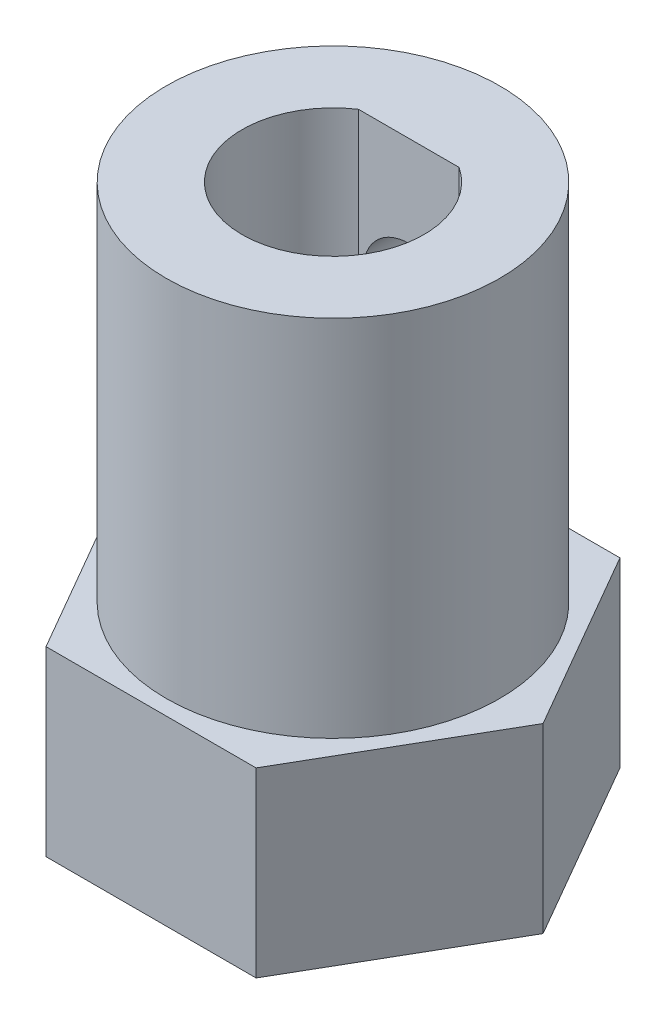
ISO-10303-21;
HEADER;
FILE_DESCRIPTION(('STEP AP214'),'2;1');
FILE_NAME('part.step','',(''),(''),'','','');
FILE_SCHEMA(('AUTOMOTIVE_DESIGN { 1 0 10303 214 1 1 1 1 }'));
ENDSEC;
DATA;
#1=APPLICATION_CONTEXT('core data for automotive mechanical design processes');
#2=APPLICATION_PROTOCOL_DEFINITION('international standard','automotive_design',2000,#1);
#3=PRODUCT_CONTEXT('',#1,'mechanical');
#4=PRODUCT('Part','Part','',(#3));
#5=PRODUCT_RELATED_PRODUCT_CATEGORY('part','',(#4));
#6=PRODUCT_DEFINITION_FORMATION('','',#4);
#7=PRODUCT_DEFINITION_CONTEXT('part definition',#1,'design');
#8=PRODUCT_DEFINITION('design','',#6,#7);
#9=PRODUCT_DEFINITION_SHAPE('','',#8);
#10=(LENGTH_UNIT() NAMED_UNIT(*) SI_UNIT(.MILLI.,.METRE.));
#11=(NAMED_UNIT(*) PLANE_ANGLE_UNIT() SI_UNIT($,.RADIAN.));
#12=(NAMED_UNIT(*) SI_UNIT($,.STERADIAN.) SOLID_ANGLE_UNIT());
#13=UNCERTAINTY_MEASURE_WITH_UNIT(LENGTH_MEASURE(1.E-05),#10,'distance_accuracy_value','');
#14=(GEOMETRIC_REPRESENTATION_CONTEXT(3) GLOBAL_UNCERTAINTY_ASSIGNED_CONTEXT((#13)) GLOBAL_UNIT_ASSIGNED_CONTEXT((#10,
#11,#12)) REPRESENTATION_CONTEXT('',''));
#15=CARTESIAN_POINT('',(0.,0.,0.));
#16=DIRECTION('',(0.,0.,1.));
#17=DIRECTION('',(1.,0.,0.));
#18=AXIS2_PLACEMENT_3D('',#15,#16,#17);
#19=CARTESIAN_POINT('',(3.46410161513776,6.,6.00000000000001));
#20=DIRECTION('',(-0.866025403784439,0.,-0.5));
#21=DIRECTION('',(-0.5,0.,0.866025403784439));
#22=AXIS2_PLACEMENT_3D('',#19,#20,#21);
#23=PLANE('',#22);
#24=DIRECTION('',(0.5,0.,-0.866025403784439));
#25=VECTOR('',#24,1.);
#26=CARTESIAN_POINT('',(3.46410161513776,0.,6.00000000000001));
#27=LINE('',#26,#25);
#28=CARTESIAN_POINT('',(3.46410161513776,0.,6.00000000000001));
#29=VERTEX_POINT('',#28);
#30=CARTESIAN_POINT('',(6.92820323027551,0.,0.));
#31=VERTEX_POINT('',#30);
#32=EDGE_CURVE('E130',#29,#31,#27,.T.);
#33=ORIENTED_EDGE('',*,*,#32,.T.);
#34=DIRECTION('',(0.,-1.,0.));
#35=VECTOR('',#34,1.);
#36=CARTESIAN_POINT('',(6.92820323027551,6.,0.));
#37=LINE('',#36,#35);
#38=CARTESIAN_POINT('',(6.92820323027551,6.,0.));
#39=VERTEX_POINT('',#38);
#40=EDGE_CURVE('E35',#39,#31,#37,.T.);
#41=ORIENTED_EDGE('',*,*,#40,.F.);
#42=DIRECTION('',(0.5,0.,-0.866025403784439));
#43=VECTOR('',#42,1.);
#44=CARTESIAN_POINT('',(3.46410161513776,6.,6.00000000000001));
#45=LINE('',#44,#43);
#46=CARTESIAN_POINT('',(3.46410161513776,6.,6.00000000000001));
#47=VERTEX_POINT('',#46);
#48=EDGE_CURVE('E142',#47,#39,#45,.T.);
#49=ORIENTED_EDGE('',*,*,#48,.F.);
#50=DIRECTION('',(0.,-1.,0.));
#51=VECTOR('',#50,1.);
#52=CARTESIAN_POINT('',(3.46410161513776,6.,6.00000000000001));
#53=LINE('',#52,#51);
#54=EDGE_CURVE('E126',#47,#29,#53,.T.);
#55=ORIENTED_EDGE('',*,*,#54,.T.);
#56=EDGE_LOOP('',(#33,#41,#49,#55));
#57=FACE_BOUND('',#56,.T.);
#58=ADVANCED_FACE('F32',(#57),#23,.F.);
#59=CARTESIAN_POINT('',(6.92820323027551,6.,0.));
#60=DIRECTION('',(-0.866025403784439,0.,0.5));
#61=DIRECTION('',(0.5,0.,0.866025403784439));
#62=AXIS2_PLACEMENT_3D('',#59,#60,#61);
#63=PLANE('',#62);
#64=DIRECTION('',(-0.5,0.,-0.866025403784439));
#65=VECTOR('',#64,1.);
#66=CARTESIAN_POINT('',(6.92820323027551,0.,0.));
#67=LINE('',#66,#65);
#68=CARTESIAN_POINT('',(3.46410161513776,0.,-6.00000000000001));
#69=VERTEX_POINT('',#68);
#70=EDGE_CURVE('E133',#31,#69,#67,.T.);
#71=ORIENTED_EDGE('',*,*,#70,.T.);
#72=DIRECTION('',(0.,-1.,0.));
#73=VECTOR('',#72,1.);
#74=CARTESIAN_POINT('',(3.46410161513776,6.,-6.00000000000001));
#75=LINE('',#74,#73);
#76=CARTESIAN_POINT('',(3.46410161513776,6.,-6.00000000000001));
#77=VERTEX_POINT('',#76);
#78=EDGE_CURVE('E145',#77,#69,#75,.T.);
#79=ORIENTED_EDGE('',*,*,#78,.F.);
#80=DIRECTION('',(-0.5,0.,-0.866025403784439));
#81=VECTOR('',#80,1.);
#82=CARTESIAN_POINT('',(6.92820323027551,6.,0.));
#83=LINE('',#82,#81);
#84=EDGE_CURVE('E92',#39,#77,#83,.T.);
#85=ORIENTED_EDGE('',*,*,#84,.F.);
#86=ORIENTED_EDGE('',*,*,#40,.T.);
#87=EDGE_LOOP('',(#71,#79,#85,#86));
#88=FACE_BOUND('',#87,.T.);
#89=ADVANCED_FACE('F150',(#88),#63,.F.);
#90=CARTESIAN_POINT('',(3.46410161513776,6.,-6.00000000000001));
#91=DIRECTION('',(0.,0.,1.));
#92=DIRECTION('',(1.,0.,0.));
#93=AXIS2_PLACEMENT_3D('',#90,#91,#92);
#94=PLANE('',#93);
#95=DIRECTION('',(-1.,0.,0.));
#96=VECTOR('',#95,1.);
#97=CARTESIAN_POINT('',(3.46410161513776,0.,-6.00000000000001));
#98=LINE('',#97,#96);
#99=CARTESIAN_POINT('',(-3.46410161513776,0.,-6.));
#100=VERTEX_POINT('',#99);
#101=EDGE_CURVE('E136',#69,#100,#98,.T.);
#102=ORIENTED_EDGE('',*,*,#101,.T.);
#103=DIRECTION('',(0.,-1.,0.));
#104=VECTOR('',#103,1.);
#105=CARTESIAN_POINT('',(-3.46410161513776,6.,-6.));
#106=LINE('',#105,#104);
#107=CARTESIAN_POINT('',(-3.46410161513776,6.,-6.));
#108=VERTEX_POINT('',#107);
#109=EDGE_CURVE('E121',#108,#100,#106,.T.);
#110=ORIENTED_EDGE('',*,*,#109,.F.);
#111=DIRECTION('',(-1.,0.,0.));
#112=VECTOR('',#111,1.);
#113=CARTESIAN_POINT('',(3.46410161513776,6.,-6.00000000000001));
#114=LINE('',#113,#112);
#115=EDGE_CURVE('E109',#77,#108,#114,.T.);
#116=ORIENTED_EDGE('',*,*,#115,.F.);
#117=ORIENTED_EDGE('',*,*,#78,.T.);
#118=EDGE_LOOP('',(#102,#110,#116,#117));
#119=FACE_BOUND('',#118,.T.);
#120=ADVANCED_FACE('F156',(#119),#94,.F.);
#121=CARTESIAN_POINT('',(-3.46410161513776,6.,-6.));
#122=DIRECTION('',(0.866025403784439,0.,0.5));
#123=DIRECTION('',(0.5,0.,-0.866025403784439));
#124=AXIS2_PLACEMENT_3D('',#121,#122,#123);
#125=PLANE('',#124);
#126=DIRECTION('',(-0.5,0.,0.866025403784439));
#127=VECTOR('',#126,1.);
#128=CARTESIAN_POINT('',(-3.46410161513776,0.,-6.));
#129=LINE('',#128,#127);
#130=CARTESIAN_POINT('',(-6.92820323027551,0.,0.));
#131=VERTEX_POINT('',#130);
#132=EDGE_CURVE('E118',#100,#131,#129,.T.);
#133=ORIENTED_EDGE('',*,*,#132,.T.);
#134=DIRECTION('',(0.,-1.,0.));
#135=VECTOR('',#134,1.);
#136=CARTESIAN_POINT('',(-6.92820323027551,6.,0.));
#137=LINE('',#136,#135);
#138=CARTESIAN_POINT('',(-6.92820323027551,6.,0.));
#139=VERTEX_POINT('',#138);
#140=EDGE_CURVE('E115',#139,#131,#137,.T.);
#141=ORIENTED_EDGE('',*,*,#140,.F.);
#142=DIRECTION('',(-0.5,0.,0.866025403784439));
#143=VECTOR('',#142,1.);
#144=CARTESIAN_POINT('',(-3.46410161513776,6.,-6.));
#145=LINE('',#144,#143);
#146=EDGE_CURVE('E102',#108,#139,#145,.T.);
#147=ORIENTED_EDGE('',*,*,#146,.F.);
#148=ORIENTED_EDGE('',*,*,#109,.T.);
#149=EDGE_LOOP('',(#133,#141,#147,#148));
#150=FACE_BOUND('',#149,.T.);
#151=ADVANCED_FACE('F116',(#150),#125,.F.);
#152=CARTESIAN_POINT('',(-6.92820323027551,6.,0.));
#153=DIRECTION('',(0.866025403784438,0.,-0.5));
#154=DIRECTION('',(-0.5,0.,-0.866025403784439));
#155=AXIS2_PLACEMENT_3D('',#152,#153,#154);
#156=PLANE('',#155);
#157=DIRECTION('',(0.5,0.,0.866025403784439));
#158=VECTOR('',#157,1.);
#159=CARTESIAN_POINT('',(-6.92820323027551,0.,0.));
#160=LINE('',#159,#158);
#161=CARTESIAN_POINT('',(-3.46410161513776,0.,6.00000000000001));
#162=VERTEX_POINT('',#161);
#163=EDGE_CURVE('E139',#131,#162,#160,.T.);
#164=ORIENTED_EDGE('',*,*,#163,.T.);
#165=DIRECTION('',(0.,-1.,0.));
#166=VECTOR('',#165,1.);
#167=CARTESIAN_POINT('',(-3.46410161513776,6.,6.00000000000001));
#168=LINE('',#167,#166);
#169=CARTESIAN_POINT('',(-3.46410161513776,6.,6.00000000000001));
#170=VERTEX_POINT('',#169);
#171=EDGE_CURVE('E122',#170,#162,#168,.T.);
#172=ORIENTED_EDGE('',*,*,#171,.F.);
#173=DIRECTION('',(0.5,0.,0.866025403784439));
#174=VECTOR('',#173,1.);
#175=CARTESIAN_POINT('',(-6.92820323027551,6.,0.));
#176=LINE('',#175,#174);
#177=EDGE_CURVE('E106',#139,#170,#176,.T.);
#178=ORIENTED_EDGE('',*,*,#177,.F.);
#179=ORIENTED_EDGE('',*,*,#140,.T.);
#180=EDGE_LOOP('',(#164,#172,#178,#179));
#181=FACE_BOUND('',#180,.T.);
#182=ADVANCED_FACE('F124',(#181),#156,.F.);
#183=CARTESIAN_POINT('',(-3.46410161513776,6.,6.00000000000001));
#184=DIRECTION('',(0.,0.,-1.));
#185=DIRECTION('',(-1.,0.,0.));
#186=AXIS2_PLACEMENT_3D('',#183,#184,#185);
#187=PLANE('',#186);
#188=DIRECTION('',(1.,0.,0.));
#189=VECTOR('',#188,1.);
#190=CARTESIAN_POINT('',(-3.46410161513776,0.,6.00000000000001));
#191=LINE('',#190,#189);
#192=EDGE_CURVE('E83',#162,#29,#191,.T.);
#193=ORIENTED_EDGE('',*,*,#192,.T.);
#194=ORIENTED_EDGE('',*,*,#54,.F.);
#195=DIRECTION('',(1.,0.,0.));
#196=VECTOR('',#195,1.);
#197=CARTESIAN_POINT('',(-3.46410161513776,6.,6.00000000000001));
#198=LINE('',#197,#196);
#199=EDGE_CURVE('E56',#170,#47,#198,.T.);
#200=ORIENTED_EDGE('',*,*,#199,.F.);
#201=ORIENTED_EDGE('',*,*,#171,.T.);
#202=EDGE_LOOP('',(#193,#194,#200,#201));
#203=FACE_BOUND('',#202,.T.);
#204=ADVANCED_FACE('F228',(#203),#187,.F.);
#205=CARTESIAN_POINT('',(0.,6.,0.));
#206=DIRECTION('',(0.,1.,0.));
#207=DIRECTION('',(0.,0.,1.));
#208=AXIS2_PLACEMENT_3D('',#205,#206,#207);
#209=PLANE('',#208);
#210=CARTESIAN_POINT('',(0.,6.,0.));
#211=DIRECTION('',(0.,1.,0.));
#212=DIRECTION('',(0.,0.,1.));
#213=AXIS2_PLACEMENT_3D('',#210,#211,#212);
#214=CIRCLE('',#213,5.5);
#215=CARTESIAN_POINT('',(0.,6.,5.5));
#216=VERTEX_POINT('',#215);
#217=EDGE_CURVE('E11',#216,#216,#214,.T.);
#218=ORIENTED_EDGE('',*,*,#217,.F.);
#219=EDGE_LOOP('',(#218));
#220=FACE_BOUND('',#219,.T.);
#221=ORIENTED_EDGE('',*,*,#48,.T.);
#222=ORIENTED_EDGE('',*,*,#84,.T.);
#223=ORIENTED_EDGE('',*,*,#115,.T.);
#224=ORIENTED_EDGE('',*,*,#146,.T.);
#225=ORIENTED_EDGE('',*,*,#177,.T.);
#226=ORIENTED_EDGE('',*,*,#199,.T.);
#227=EDGE_LOOP('',(#221,#222,#223,#224,#225,#226));
#228=FACE_BOUND('',#227,.T.);
#229=ADVANCED_FACE('F104',(#220,#228),#209,.T.);
#230=CARTESIAN_POINT('',(0.,0.,0.));
#231=DIRECTION('',(0.,1.,0.));
#232=DIRECTION('',(0.,0.,1.));
#233=AXIS2_PLACEMENT_3D('',#230,#231,#232);
#234=PLANE('',#233);
#235=CARTESIAN_POINT('',(0.,0.,0.));
#236=DIRECTION('',(0.,-1.,0.));
#237=DIRECTION('',(0.,0.,-1.));
#238=AXIS2_PLACEMENT_3D('',#235,#236,#237);
#239=CIRCLE('',#238,2.);
#240=CARTESIAN_POINT('',(0.,0.,-2.));
#241=VERTEX_POINT('',#240);
#242=EDGE_CURVE('E286',#241,#241,#239,.T.);
#243=ORIENTED_EDGE('',*,*,#242,.F.);
#244=EDGE_LOOP('',(#243));
#245=FACE_BOUND('',#244,.T.);
#246=ORIENTED_EDGE('',*,*,#32,.F.);
#247=ORIENTED_EDGE('',*,*,#192,.F.);
#248=ORIENTED_EDGE('',*,*,#163,.F.);
#249=ORIENTED_EDGE('',*,*,#132,.F.);
#250=ORIENTED_EDGE('',*,*,#101,.F.);
#251=ORIENTED_EDGE('',*,*,#70,.F.);
#252=EDGE_LOOP('',(#246,#247,#248,#249,#250,#251));
#253=FACE_BOUND('',#252,.T.);
#254=ADVANCED_FACE('F155',(#245,#253),#234,.F.);
#255=CARTESIAN_POINT('',(0.,18.,0.));
#256=DIRECTION('',(0.,-1.,0.));
#257=DIRECTION('',(0.,0.,-1.));
#258=AXIS2_PLACEMENT_3D('',#255,#256,#257);
#259=CYLINDRICAL_SURFACE('',#258,5.5);
#260=CARTESIAN_POINT('',(0.,15.,-5.5));
#261=CARTESIAN_POINT('',(-0.0826209133321935,14.999998187389,-5.49999882717412));
#262=CARTESIAN_POINT('',(-0.165260978812708,14.9931509364166,-5.49812007260761));
#263=CARTESIAN_POINT('',(-0.328155930157697,14.9659941696968,-5.49080798085451));
#264=CARTESIAN_POINT('',(-0.408409727977265,14.9456786083714,-5.48537304740499));
#265=CARTESIAN_POINT('',(-0.564157626055395,14.8922982682616,-5.47154772174135));
#266=CARTESIAN_POINT('',(-0.639657866970163,14.8592503473381,-5.46316123869395));
#267=CARTESIAN_POINT('',(-0.78404449615972,14.7814070673376,-5.44431654412848));
#268=CARTESIAN_POINT('',(-0.852930363289777,14.7366107836461,-5.43385816956517));
#269=CARTESIAN_POINT('',(-0.983796947573261,14.6354001635327,-5.41171397042059));
#270=CARTESIAN_POINT('',(-1.04559512916994,14.5787545591458,-5.40000641490429));
#271=CARTESIAN_POINT('',(-1.15894293682478,14.4559473639701,-5.37682112935063));
#272=CARTESIAN_POINT('',(-1.21049117824722,14.3897844895977,-5.36534343055203));
#273=CARTESIAN_POINT('',(-1.30277794539497,14.2483487524205,-5.34369384163659));
#274=CARTESIAN_POINT('',(-1.34330426837586,14.1729328550637,-5.33354930058623));
#275=CARTESIAN_POINT('',(-1.41102916361228,14.0160361718006,-5.31603507411917));
#276=CARTESIAN_POINT('',(-1.43823031946844,13.9345565651115,-5.30866485085754));
#277=CARTESIAN_POINT('',(-1.47789456441268,13.7698721049875,-5.2977584719274));
#278=CARTESIAN_POINT('',(-1.49068960543229,13.6867530518381,-5.29413612283787));
#279=CARTESIAN_POINT('',(-1.50221364409134,13.5194753169912,-5.29087829084083));
#280=CARTESIAN_POINT('',(-1.50094540140882,13.4353168425,-5.2912420257326));
#281=CARTESIAN_POINT('',(-1.48464191780301,13.2709584490337,-5.29583824875456));
#282=CARTESIAN_POINT('',(-1.47001073668932,13.1907147653978,-5.29995718313671));
#283=CARTESIAN_POINT('',(-1.42804483871807,13.0338667139772,-5.31141755794059));
#284=CARTESIAN_POINT('',(-1.40070906504647,12.9572626495337,-5.31875926644153));
#285=CARTESIAN_POINT('',(-1.3337862982647,12.8088264794526,-5.33593618292326));
#286=CARTESIAN_POINT('',(-1.29405951882948,12.7370607989664,-5.34579959764141));
#287=CARTESIAN_POINT('',(-1.20357988022174,12.6010735525903,-5.36689368797792));
#288=CARTESIAN_POINT('',(-1.15282476106209,12.5368535371613,-5.37812464363249));
#289=CARTESIAN_POINT('',(-1.03967346682896,12.4154748101936,-5.40115894990605));
#290=CARTESIAN_POINT('',(-0.976938646167253,12.3586325507111,-5.41296874297114));
#291=CARTESIAN_POINT('',(-0.842682011788638,12.2562090350222,-5.43548647707978));
#292=CARTESIAN_POINT('',(-0.771159819718556,12.2106282639504,-5.44619437064292));
#293=CARTESIAN_POINT('',(-0.620853953739625,12.1318733272251,-5.46537278121261));
#294=CARTESIAN_POINT('',(-0.542037637417775,12.0987586614161,-5.47383251287305));
#295=CARTESIAN_POINT('',(-0.379672688714392,12.0463420274859,-5.48748356142612));
#296=CARTESIAN_POINT('',(-0.296125144317683,12.0270368975559,-5.49267562644564));
#297=CARTESIAN_POINT('',(-0.129368170483252,12.003289382203,-5.49909228776313));
#298=CARTESIAN_POINT('',(-0.0462242977839815,11.9984170046796,-5.50043163125371));
#299=CARTESIAN_POINT('',(0.119693365637971,12.0024827475134,-5.49932301585136));
#300=CARTESIAN_POINT('',(0.202467195532506,12.0114193696165,-5.49687546782998));
#301=CARTESIAN_POINT('',(0.363745097739556,12.0424975027031,-5.48854239265957));
#302=CARTESIAN_POINT('',(0.442299324272676,12.064397192757,-5.48271986472129));
#303=CARTESIAN_POINT('',(0.594609867448631,12.1204972446405,-5.46829923535645));
#304=CARTESIAN_POINT('',(0.668365651304995,12.1546989696613,-5.45970082634473));
#305=CARTESIAN_POINT('',(0.810641161194589,12.2352164422857,-5.44041573828275));
#306=CARTESIAN_POINT('',(0.879024602412581,12.2817634872616,-5.4296902954988));
#307=CARTESIAN_POINT('',(1.00716022013082,12.3853612875452,-5.40738988410035));
#308=CARTESIAN_POINT('',(1.06691060617763,12.4424142161575,-5.39581474001048));
#309=CARTESIAN_POINT('',(1.17791060344312,12.5674140380349,-5.37269401558495));
#310=CARTESIAN_POINT('',(1.22885627747222,12.635633382279,-5.36115944983886));
#311=CARTESIAN_POINT('',(1.3185858220796,12.7798986472193,-5.33980026187814));
#312=CARTESIAN_POINT('',(1.35737017925923,12.8559442546075,-5.32997557125461));
#313=CARTESIAN_POINT('',(1.42138558317209,13.013340628242,-5.31326248703816));
#314=CARTESIAN_POINT('',(1.44669352306985,13.0946582605252,-5.30635748202252));
#315=CARTESIAN_POINT('',(1.48320917220691,13.2606168380276,-5.29626814696188));
#316=CARTESIAN_POINT('',(1.49442068863148,13.3452568795537,-5.29308281231876));
#317=CARTESIAN_POINT('',(1.50219895576908,13.5123384038175,-5.29088009671763));
#318=CARTESIAN_POINT('',(1.49925533217026,13.5947555887225,-5.29172336001588));
#319=CARTESIAN_POINT('',(1.47994837643976,13.757870647735,-5.29715501736986));
#320=CARTESIAN_POINT('',(1.46358542028567,13.838568569947,-5.30174330649891));
#321=CARTESIAN_POINT('',(1.41819408435119,13.9953063157761,-5.31406316491799));
#322=CARTESIAN_POINT('',(1.38927395449127,14.0713797532418,-5.32176783125817));
#323=CARTESIAN_POINT('',(1.31967304541385,14.2176532768133,-5.33945189987964));
#324=CARTESIAN_POINT('',(1.27899034504456,14.2878524010652,-5.34943167369227));
#325=CARTESIAN_POINT('',(1.18555430984851,14.4227105976927,-5.37092379381814));
#326=CARTESIAN_POINT('',(1.13246901822125,14.4871337048431,-5.38247375845259));
#327=CARTESIAN_POINT('',(1.01636011199274,14.6063164067946,-5.40559990490855));
#328=CARTESIAN_POINT('',(0.953334059387993,14.6610736240053,-5.41717609247304));
#329=CARTESIAN_POINT('',(0.817407725686078,14.7605946145194,-5.43936459177359));
#330=CARTESIAN_POINT('',(0.74431586626252,14.805103480867,-5.44994907753807));
#331=CARTESIAN_POINT('',(0.59139989983928,14.8811324362115,-5.46865263780403));
#332=CARTESIAN_POINT('',(0.511579952421221,14.9126604805543,-5.47677322151197));
#333=CARTESIAN_POINT('',(0.360100101218211,14.957939509979,-5.48864193995757));
#334=CARTESIAN_POINT('',(0.289064640262469,14.9736745512417,-5.49286947681091));
#335=CARTESIAN_POINT('',(0.145357607941485,14.9947050253188,-5.49854887164354));
#336=CARTESIAN_POINT('',(0.0726862155649473,15.0000015946548,-5.5000010318002));
#337=CARTESIAN_POINT('',(0.,15.,-5.5));
#338=B_SPLINE_CURVE_WITH_KNOTS('',3,(#260,#261,#262,#263,#264,#265,#266,#267,#268,#269,#270,
#271,#272,#273,#274,#275,#276,#277,#278,#279,#280,#281,#282,#283,#284,#285,#286,#287,#288,#289,
#290,#291,#292,#293,#294,#295,#296,#297,#298,#299,#300,#301,#302,#303,#304,#305,#306,#307,#308,
#309,#310,#311,#312,#313,#314,#315,#316,#317,#318,#319,#320,#321,#322,#323,#324,#325,#326,#327,
#328,#329,#330,#331,#332,#333,#334,#335,#336,#337),.UNSPECIFIED.,.T.,.F.,(4,2,2,2,2,2,2,2,2,2,2,
2,2,2,2,2,2,2,2,2,2,2,2,2,2,2,2,2,2,2,2,2,2,2,2,2,2,2,4),(0.,0.247596106854897,0.4953034285513,
0.742683902420579,0.990083851364706,1.24285878223179,1.49566783659324,1.75304593650219,
2.01037411390996,2.26164304860926,2.51286267696538,2.75672886674887,3.00061534583717,
3.24735926767928,3.49415380139121,3.74938528550775,4.00462776284424,4.26107349736028,
4.51746049766944,4.76612811343083,5.01476875105251,5.25891111200195,5.50308053475836,
5.75219469009681,6.00136043656003,6.2579007306487,6.51443075867912,6.76948096455404,
7.02446227124211,7.27068852228629,7.51690787489588,7.76104555655817,8.00522313517586,
8.25689011392092,8.50861891104974,8.76605872289058,9.02334052607436,9.2411883209319,
9.45901239561305),.UNSPECIFIED.);
#339=CARTESIAN_POINT('',(0.,15.,-5.5));
#340=VERTEX_POINT('',#339);
#341=EDGE_CURVE('E172',#340,#340,#338,.T.);
#342=ORIENTED_EDGE('',*,*,#341,.T.);
#343=EDGE_LOOP('',(#342));
#344=FACE_BOUND('',#343,.T.);
#345=CARTESIAN_POINT('',(0.,18.,0.));
#346=DIRECTION('',(0.,1.,0.));
#347=DIRECTION('',(0.,0.,1.));
#348=AXIS2_PLACEMENT_3D('',#345,#346,#347);
#349=CIRCLE('',#348,5.5);
#350=CARTESIAN_POINT('',(0.,18.,5.5));
#351=VERTEX_POINT('',#350);
#352=EDGE_CURVE('E134',#351,#351,#349,.T.);
#353=ORIENTED_EDGE('',*,*,#352,.F.);
#354=EDGE_LOOP('',(#353));
#355=FACE_BOUND('',#354,.T.);
#356=ORIENTED_EDGE('',*,*,#217,.T.);
#357=EDGE_LOOP('',(#356));
#358=FACE_BOUND('',#357,.T.);
#359=ADVANCED_FACE('F186',(#344,#355,#358),#259,.T.);
#360=CARTESIAN_POINT('',(0.,18.,0.));
#361=DIRECTION('',(0.,1.,0.));
#362=DIRECTION('',(0.,0.,1.));
#363=AXIS2_PLACEMENT_3D('',#360,#361,#362);
#364=PLANE('',#363);
#365=CARTESIAN_POINT('',(0.,18.,0.));
#366=DIRECTION('',(0.,1.,0.));
#367=DIRECTION('',(0.,0.,1.));
#368=AXIS2_PLACEMENT_3D('',#365,#366,#367);
#369=CIRCLE('',#368,3.);
#370=CARTESIAN_POINT('',(-1.6583123951777,18.,-2.5));
#371=VERTEX_POINT('',#370);
#372=CARTESIAN_POINT('',(1.6583123951777,18.,-2.5));
#373=VERTEX_POINT('',#372);
#374=EDGE_CURVE('E47',#371,#373,#369,.T.);
#375=ORIENTED_EDGE('',*,*,#374,.F.);
#376=DIRECTION('',(-1.,0.,0.));
#377=VECTOR('',#376,1.);
#378=CARTESIAN_POINT('',(-1.6583123951777,18.,-2.5));
#379=LINE('',#378,#377);
#380=EDGE_CURVE('E167',#373,#371,#379,.T.);
#381=ORIENTED_EDGE('',*,*,#380,.F.);
#382=EDGE_LOOP('',(#375,#381));
#383=FACE_BOUND('',#382,.T.);
#384=ORIENTED_EDGE('',*,*,#352,.T.);
#385=EDGE_LOOP('',(#384));
#386=FACE_BOUND('',#385,.T.);
#387=ADVANCED_FACE('F207',(#383,#386),#364,.T.);
#388=CARTESIAN_POINT('',(0.,6.,0.));
#389=DIRECTION('',(0.,1.,0.));
#390=DIRECTION('',(0.,0.,1.));
#391=AXIS2_PLACEMENT_3D('',#388,#389,#390);
#392=CYLINDRICAL_SURFACE('',#391,3.);
#393=ORIENTED_EDGE('',*,*,#374,.T.);
#394=DIRECTION('',(0.,1.,0.));
#395=VECTOR('',#394,1.);
#396=CARTESIAN_POINT('',(1.6583123951777,6.,-2.5));
#397=LINE('',#396,#395);
#398=CARTESIAN_POINT('',(1.6583123951777,6.,-2.5));
#399=VERTEX_POINT('',#398);
#400=EDGE_CURVE('E163',#399,#373,#397,.T.);
#401=ORIENTED_EDGE('',*,*,#400,.F.);
#402=CARTESIAN_POINT('',(0.,6.,0.));
#403=DIRECTION('',(0.,1.,0.));
#404=DIRECTION('',(0.,0.,1.));
#405=AXIS2_PLACEMENT_3D('',#402,#403,#404);
#406=CIRCLE('',#405,3.);
#407=CARTESIAN_POINT('',(-1.6583123951777,6.,-2.5));
#408=VERTEX_POINT('',#407);
#409=EDGE_CURVE('E170',#408,#399,#406,.T.);
#410=ORIENTED_EDGE('',*,*,#409,.F.);
#411=DIRECTION('',(0.,1.,0.));
#412=VECTOR('',#411,1.);
#413=CARTESIAN_POINT('',(-1.6583123951777,6.,-2.5));
#414=LINE('',#413,#412);
#415=EDGE_CURVE('E162',#408,#371,#414,.T.);
#416=ORIENTED_EDGE('',*,*,#415,.T.);
#417=EDGE_LOOP('',(#393,#401,#410,#416));
#418=FACE_BOUND('',#417,.T.);
#419=ADVANCED_FACE('F204',(#418),#392,.F.);
#420=CARTESIAN_POINT('',(-1.6583123951777,6.,-2.5));
#421=DIRECTION('',(0.,0.,-1.));
#422=DIRECTION('',(-1.,0.,0.));
#423=AXIS2_PLACEMENT_3D('',#420,#421,#422);
#424=PLANE('',#423);
#425=CARTESIAN_POINT('',(0.,13.5,-2.5));
#426=DIRECTION('',(0.,0.,-1.));
#427=DIRECTION('',(-1.,0.,0.));
#428=AXIS2_PLACEMENT_3D('',#425,#426,#427);
#429=CIRCLE('',#428,1.5);
#430=CARTESIAN_POINT('',(-1.5,13.5,-2.5));
#431=VERTEX_POINT('',#430);
#432=EDGE_CURVE('E184',#431,#431,#429,.F.);
#433=ORIENTED_EDGE('',*,*,#432,.F.);
#434=EDGE_LOOP('',(#433));
#435=FACE_BOUND('',#434,.T.);
#436=ORIENTED_EDGE('',*,*,#380,.T.);
#437=ORIENTED_EDGE('',*,*,#415,.F.);
#438=DIRECTION('',(-1.,0.,0.));
#439=VECTOR('',#438,1.);
#440=CARTESIAN_POINT('',(-1.6583123951777,6.,-2.5));
#441=LINE('',#440,#439);
#442=EDGE_CURVE('E165',#399,#408,#441,.T.);
#443=ORIENTED_EDGE('',*,*,#442,.F.);
#444=ORIENTED_EDGE('',*,*,#400,.T.);
#445=EDGE_LOOP('',(#436,#437,#443,#444));
#446=FACE_BOUND('',#445,.T.);
#447=ADVANCED_FACE('F200',(#435,#446),#424,.F.);
#448=CARTESIAN_POINT('',(0.,6.,0.));
#449=DIRECTION('',(0.,1.,0.));
#450=DIRECTION('',(0.,0.,1.));
#451=AXIS2_PLACEMENT_3D('',#448,#449,#450);
#452=PLANE('',#451);
#453=CARTESIAN_POINT('',(0.,6.,0.));
#454=DIRECTION('',(0.,1.,0.));
#455=DIRECTION('',(0.,0.,1.));
#456=AXIS2_PLACEMENT_3D('',#453,#454,#455);
#457=CIRCLE('',#456,2.);
#458=CARTESIAN_POINT('',(0.,6.,2.));
#459=VERTEX_POINT('',#458);
#460=EDGE_CURVE('E289',#459,#459,#457,.F.);
#461=ORIENTED_EDGE('',*,*,#460,.T.);
#462=EDGE_LOOP('',(#461));
#463=FACE_BOUND('',#462,.T.);
#464=ORIENTED_EDGE('',*,*,#409,.T.);
#465=ORIENTED_EDGE('',*,*,#442,.T.);
#466=EDGE_LOOP('',(#464,#465));
#467=FACE_BOUND('',#466,.T.);
#468=ADVANCED_FACE('F196',(#463,#467),#452,.T.);
#469=CARTESIAN_POINT('',(0.,13.5,1.74264068711929));
#470=DIRECTION('',(0.,0.,-1.));
#471=DIRECTION('',(-1.,0.,0.));
#472=AXIS2_PLACEMENT_3D('',#469,#470,#471);
#473=CYLINDRICAL_SURFACE('',#472,1.5);
#474=ORIENTED_EDGE('',*,*,#432,.T.);
#475=EDGE_LOOP('',(#474));
#476=FACE_BOUND('',#475,.T.);
#477=ORIENTED_EDGE('',*,*,#341,.F.);
#478=EDGE_LOOP('',(#477));
#479=FACE_BOUND('',#478,.T.);
#480=ADVANCED_FACE('F190',(#476,#479),#473,.F.);
#481=CARTESIAN_POINT('',(0.,11.6568542494924,0.));
#482=DIRECTION('',(0.,-1.,0.));
#483=DIRECTION('',(0.,0.,-1.));
#484=AXIS2_PLACEMENT_3D('',#481,#482,#483);
#485=CYLINDRICAL_SURFACE('',#484,2.);
#486=ORIENTED_EDGE('',*,*,#242,.T.);
#487=EDGE_LOOP('',(#486));
#488=FACE_BOUND('',#487,.T.);
#489=ORIENTED_EDGE('',*,*,#460,.F.);
#490=EDGE_LOOP('',(#489));
#491=FACE_BOUND('',#490,.T.);
#492=ADVANCED_FACE('F195',(#488,#491),#485,.F.);
#493=CLOSED_SHELL('',(#58,#89,#120,#151,#182,#204,#229,#254,#359,#387,#419,#447,#468,#480,#492));
#494=MANIFOLD_SOLID_BREP('B2',#493);
#495=ADVANCED_BREP_SHAPE_REPRESENTATION('',(#18,#494),#14);
#496=SHAPE_DEFINITION_REPRESENTATION(#9,#495);
ENDSEC;
END-ISO-10303-21;
